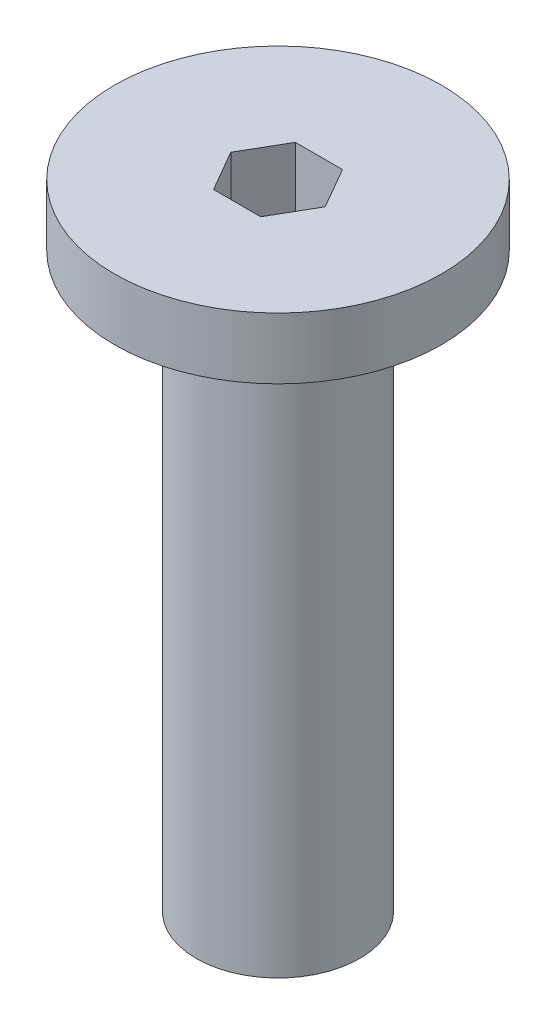
ISO-10303-21;
HEADER;
FILE_DESCRIPTION(('STEP AP214'),'2;1');
FILE_NAME('part.step','',(''),(''),'','','');
FILE_SCHEMA(('AUTOMOTIVE_DESIGN { 1 0 10303 214 1 1 1 1 }'));
ENDSEC;
DATA;
#1=APPLICATION_CONTEXT('core data for automotive mechanical design processes');
#2=APPLICATION_PROTOCOL_DEFINITION('international standard','automotive_design',2000,#1);
#3=PRODUCT_CONTEXT('',#1,'mechanical');
#4=PRODUCT('Part','Part','',(#3));
#5=PRODUCT_RELATED_PRODUCT_CATEGORY('part','',(#4));
#6=PRODUCT_DEFINITION_FORMATION('','',#4);
#7=PRODUCT_DEFINITION_CONTEXT('part definition',#1,'design');
#8=PRODUCT_DEFINITION('design','',#6,#7);
#9=PRODUCT_DEFINITION_SHAPE('','',#8);
#10=(LENGTH_UNIT() NAMED_UNIT(*) SI_UNIT(.MILLI.,.METRE.));
#11=(NAMED_UNIT(*) PLANE_ANGLE_UNIT() SI_UNIT($,.RADIAN.));
#12=(NAMED_UNIT(*) SI_UNIT($,.STERADIAN.) SOLID_ANGLE_UNIT());
#13=UNCERTAINTY_MEASURE_WITH_UNIT(LENGTH_MEASURE(1.E-05),#10,'distance_accuracy_value','');
#14=(GEOMETRIC_REPRESENTATION_CONTEXT(3) GLOBAL_UNCERTAINTY_ASSIGNED_CONTEXT((#13)) GLOBAL_UNIT_ASSIGNED_CONTEXT((#10,
#11,#12)) REPRESENTATION_CONTEXT('',''));
#15=CARTESIAN_POINT('',(0.,0.,0.));
#16=DIRECTION('',(0.,0.,1.));
#17=DIRECTION('',(1.,0.,0.));
#18=AXIS2_PLACEMENT_3D('',#15,#16,#17);
#19=CARTESIAN_POINT('',(4.00000000000001,1.5,0.));
#20=DIRECTION('',(0.,-1.,0.));
#21=DIRECTION('',(0.,0.,-1.));
#22=AXIS2_PLACEMENT_3D('',#19,#20,#21);
#23=PLANE('',#22);
#24=DIRECTION('',(-1.,0.,0.));
#25=VECTOR('',#24,1.);
#26=CARTESIAN_POINT('',(0.577350269189626,1.5,-1.));
#27=LINE('',#26,#25);
#28=CARTESIAN_POINT('',(0.577350269189625,1.5,-1.));
#29=VERTEX_POINT('',#28);
#30=CARTESIAN_POINT('',(-0.577350269189626,1.5,-1.));
#31=VERTEX_POINT('',#30);
#32=EDGE_CURVE('E124',#29,#31,#27,.T.);
#33=ORIENTED_EDGE('',*,*,#32,.F.);
#34=DIRECTION('',(-0.5,0.,-0.866025403784439));
#35=VECTOR('',#34,1.);
#36=CARTESIAN_POINT('',(1.15470053837925,1.5,0.));
#37=LINE('',#36,#35);
#38=CARTESIAN_POINT('',(1.15470053837925,1.5,0.));
#39=VERTEX_POINT('',#38);
#40=EDGE_CURVE('E50',#39,#29,#37,.T.);
#41=ORIENTED_EDGE('',*,*,#40,.F.);
#42=DIRECTION('',(0.5,0.,-0.866025403784439));
#43=VECTOR('',#42,1.);
#44=CARTESIAN_POINT('',(0.577350269189626,1.5,1.));
#45=LINE('',#44,#43);
#46=CARTESIAN_POINT('',(0.577350269189626,1.5,1.));
#47=VERTEX_POINT('',#46);
#48=EDGE_CURVE('E133',#47,#39,#45,.T.);
#49=ORIENTED_EDGE('',*,*,#48,.F.);
#50=DIRECTION('',(1.,0.,0.));
#51=VECTOR('',#50,1.);
#52=CARTESIAN_POINT('',(-0.577350269189626,1.5,1.));
#53=LINE('',#52,#51);
#54=CARTESIAN_POINT('',(-0.577350269189626,1.5,1.));
#55=VERTEX_POINT('',#54);
#56=EDGE_CURVE('E131',#55,#47,#53,.T.);
#57=ORIENTED_EDGE('',*,*,#56,.F.);
#58=DIRECTION('',(0.5,0.,0.866025403784439));
#59=VECTOR('',#58,1.);
#60=CARTESIAN_POINT('',(-1.15470053837925,1.5,0.));
#61=LINE('',#60,#59);
#62=CARTESIAN_POINT('',(-1.15470053837925,1.5,0.));
#63=VERTEX_POINT('',#62);
#64=EDGE_CURVE('E98',#63,#55,#61,.T.);
#65=ORIENTED_EDGE('',*,*,#64,.F.);
#66=DIRECTION('',(-0.5,0.,0.866025403784439));
#67=VECTOR('',#66,1.);
#68=CARTESIAN_POINT('',(-0.577350269189626,1.5,-1.));
#69=LINE('',#68,#67);
#70=EDGE_CURVE('E127',#31,#63,#69,.T.);
#71=ORIENTED_EDGE('',*,*,#70,.F.);
#72=EDGE_LOOP('',(#33,#41,#49,#57,#65,#71));
#73=FACE_BOUND('',#72,.T.);
#74=CARTESIAN_POINT('',(0.,1.5,0.));
#75=DIRECTION('',(0.,1.,0.));
#76=DIRECTION('',(0.,0.,1.));
#77=AXIS2_PLACEMENT_3D('',#74,#75,#76);
#78=CIRCLE('',#77,4.00000000000001);
#79=CARTESIAN_POINT('',(0.,1.5,4.00000000000001));
#80=VERTEX_POINT('',#79);
#81=EDGE_CURVE('E11',#80,#80,#78,.T.);
#82=ORIENTED_EDGE('',*,*,#81,.T.);
#83=EDGE_LOOP('',(#82));
#84=FACE_BOUND('',#83,.T.);
#85=ADVANCED_FACE('F36',(#73,#84),#23,.F.);
#86=CARTESIAN_POINT('',(0.,61.6916426261037,0.));
#87=DIRECTION('',(0.,1.,0.));
#88=DIRECTION('',(0.,0.,1.));
#89=AXIS2_PLACEMENT_3D('',#86,#87,#88);
#90=CYLINDRICAL_SURFACE('',#89,4.00000000000001);
#91=ORIENTED_EDGE('',*,*,#81,.F.);
#92=EDGE_LOOP('',(#91));
#93=FACE_BOUND('',#92,.T.);
#94=CARTESIAN_POINT('',(0.,0.,0.));
#95=DIRECTION('',(0.,1.,0.));
#96=DIRECTION('',(0.,0.,1.));
#97=AXIS2_PLACEMENT_3D('',#94,#95,#96);
#98=CIRCLE('',#97,4.00000000000001);
#99=CARTESIAN_POINT('',(0.,0.,4.00000000000001));
#100=VERTEX_POINT('',#99);
#101=EDGE_CURVE('E43',#100,#100,#98,.T.);
#102=ORIENTED_EDGE('',*,*,#101,.T.);
#103=EDGE_LOOP('',(#102));
#104=FACE_BOUND('',#103,.T.);
#105=ADVANCED_FACE('F150',(#93,#104),#90,.T.);
#106=CARTESIAN_POINT('',(2.00000000000001,0.,0.));
#107=DIRECTION('',(0.,1.,0.));
#108=DIRECTION('',(0.,0.,1.));
#109=AXIS2_PLACEMENT_3D('',#106,#107,#108);
#110=PLANE('',#109);
#111=ORIENTED_EDGE('',*,*,#101,.F.);
#112=EDGE_LOOP('',(#111));
#113=FACE_BOUND('',#112,.T.);
#114=CARTESIAN_POINT('',(0.,0.,0.));
#115=DIRECTION('',(0.,1.,0.));
#116=DIRECTION('',(0.,0.,1.));
#117=AXIS2_PLACEMENT_3D('',#114,#115,#116);
#118=CIRCLE('',#117,2.00000000000001);
#119=CARTESIAN_POINT('',(0.,0.,2.00000000000001));
#120=VERTEX_POINT('',#119);
#121=EDGE_CURVE('E145',#120,#120,#118,.T.);
#122=ORIENTED_EDGE('',*,*,#121,.T.);
#123=EDGE_LOOP('',(#122));
#124=FACE_BOUND('',#123,.T.);
#125=ADVANCED_FACE('F152',(#113,#124),#110,.F.);
#126=CARTESIAN_POINT('',(0.,61.6916426261037,0.));
#127=DIRECTION('',(0.,1.,0.));
#128=DIRECTION('',(0.,0.,1.));
#129=AXIS2_PLACEMENT_3D('',#126,#127,#128);
#130=CYLINDRICAL_SURFACE('',#129,2.00000000000001);
#131=ORIENTED_EDGE('',*,*,#121,.F.);
#132=EDGE_LOOP('',(#131));
#133=FACE_BOUND('',#132,.T.);
#134=CARTESIAN_POINT('',(0.,-14.,0.));
#135=DIRECTION('',(0.,1.,0.));
#136=DIRECTION('',(0.,0.,1.));
#137=AXIS2_PLACEMENT_3D('',#134,#135,#136);
#138=CIRCLE('',#137,2.00000000000001);
#139=CARTESIAN_POINT('',(0.,-14.,2.00000000000001));
#140=VERTEX_POINT('',#139);
#141=EDGE_CURVE('E137',#140,#140,#138,.T.);
#142=ORIENTED_EDGE('',*,*,#141,.T.);
#143=EDGE_LOOP('',(#142));
#144=FACE_BOUND('',#143,.T.);
#145=ADVANCED_FACE('F155',(#133,#144),#130,.T.);
#146=CARTESIAN_POINT('',(0.,-14.,0.));
#147=DIRECTION('',(0.,1.,0.));
#148=DIRECTION('',(0.,0.,1.));
#149=AXIS2_PLACEMENT_3D('',#146,#147,#148);
#150=PLANE('',#149);
#151=ORIENTED_EDGE('',*,*,#141,.F.);
#152=EDGE_LOOP('',(#151));
#153=FACE_BOUND('',#152,.T.);
#154=ADVANCED_FACE('F161',(#153),#150,.F.);
#155=CARTESIAN_POINT('',(1.15470053837925,-1.,0.));
#156=DIRECTION('',(0.866025403784439,0.,-0.5));
#157=DIRECTION('',(-0.5,0.,-0.866025403784439));
#158=AXIS2_PLACEMENT_3D('',#155,#156,#157);
#159=PLANE('',#158);
#160=ORIENTED_EDGE('',*,*,#40,.T.);
#161=DIRECTION('',(0.,1.,0.));
#162=VECTOR('',#161,1.);
#163=CARTESIAN_POINT('',(0.577350269189626,-1.,-1.));
#164=LINE('',#163,#162);
#165=CARTESIAN_POINT('',(0.577350269189626,-1.,-1.));
#166=VERTEX_POINT('',#165);
#167=EDGE_CURVE('E80',#166,#29,#164,.T.);
#168=ORIENTED_EDGE('',*,*,#167,.F.);
#169=DIRECTION('',(-0.5,0.,-0.866025403784439));
#170=VECTOR('',#169,1.);
#171=CARTESIAN_POINT('',(1.15470053837925,-1.,0.));
#172=LINE('',#171,#170);
#173=CARTESIAN_POINT('',(1.15470053837925,-1.,0.));
#174=VERTEX_POINT('',#173);
#175=EDGE_CURVE('E135',#174,#166,#172,.T.);
#176=ORIENTED_EDGE('',*,*,#175,.F.);
#177=DIRECTION('',(0.,1.,0.));
#178=VECTOR('',#177,1.);
#179=CARTESIAN_POINT('',(1.15470053837925,-1.,0.));
#180=LINE('',#179,#178);
#181=EDGE_CURVE('E58',#174,#39,#180,.T.);
#182=ORIENTED_EDGE('',*,*,#181,.T.);
#183=EDGE_LOOP('',(#160,#168,#176,#182));
#184=FACE_BOUND('',#183,.T.);
#185=ADVANCED_FACE('F166',(#184),#159,.F.);
#186=CARTESIAN_POINT('',(0.577350269189626,-1.,1.));
#187=DIRECTION('',(0.866025403784439,0.,0.5));
#188=DIRECTION('',(0.5,0.,-0.866025403784439));
#189=AXIS2_PLACEMENT_3D('',#186,#187,#188);
#190=PLANE('',#189);
#191=ORIENTED_EDGE('',*,*,#48,.T.);
#192=ORIENTED_EDGE('',*,*,#181,.F.);
#193=DIRECTION('',(0.5,0.,-0.866025403784439));
#194=VECTOR('',#193,1.);
#195=CARTESIAN_POINT('',(0.577350269189626,-1.,1.));
#196=LINE('',#195,#194);
#197=CARTESIAN_POINT('',(0.577350269189626,-1.,1.));
#198=VERTEX_POINT('',#197);
#199=EDGE_CURVE('E110',#198,#174,#196,.T.);
#200=ORIENTED_EDGE('',*,*,#199,.F.);
#201=DIRECTION('',(0.,1.,0.));
#202=VECTOR('',#201,1.);
#203=CARTESIAN_POINT('',(0.577350269189626,-1.,1.));
#204=LINE('',#203,#202);
#205=EDGE_CURVE('E102',#198,#47,#204,.T.);
#206=ORIENTED_EDGE('',*,*,#205,.T.);
#207=EDGE_LOOP('',(#191,#192,#200,#206));
#208=FACE_BOUND('',#207,.T.);
#209=ADVANCED_FACE('F171',(#208),#190,.F.);
#210=CARTESIAN_POINT('',(-0.577350269189626,-1.,1.));
#211=DIRECTION('',(0.,0.,1.));
#212=DIRECTION('',(1.,0.,0.));
#213=AXIS2_PLACEMENT_3D('',#210,#211,#212);
#214=PLANE('',#213);
#215=ORIENTED_EDGE('',*,*,#56,.T.);
#216=ORIENTED_EDGE('',*,*,#205,.F.);
#217=DIRECTION('',(1.,0.,0.));
#218=VECTOR('',#217,1.);
#219=CARTESIAN_POINT('',(-0.577350269189626,-1.,1.));
#220=LINE('',#219,#218);
#221=CARTESIAN_POINT('',(-0.577350269189626,-1.,1.));
#222=VERTEX_POINT('',#221);
#223=EDGE_CURVE('E106',#222,#198,#220,.T.);
#224=ORIENTED_EDGE('',*,*,#223,.F.);
#225=DIRECTION('',(0.,1.,0.));
#226=VECTOR('',#225,1.);
#227=CARTESIAN_POINT('',(-0.577350269189626,-1.,1.));
#228=LINE('',#227,#226);
#229=EDGE_CURVE('E91',#222,#55,#228,.T.);
#230=ORIENTED_EDGE('',*,*,#229,.T.);
#231=EDGE_LOOP('',(#215,#216,#224,#230));
#232=FACE_BOUND('',#231,.T.);
#233=ADVANCED_FACE('F107',(#232),#214,.F.);
#234=CARTESIAN_POINT('',(-1.15470053837925,-1.,0.));
#235=DIRECTION('',(-0.866025403784438,0.,0.5));
#236=DIRECTION('',(0.5,0.,0.866025403784439));
#237=AXIS2_PLACEMENT_3D('',#234,#235,#236);
#238=PLANE('',#237);
#239=ORIENTED_EDGE('',*,*,#64,.T.);
#240=ORIENTED_EDGE('',*,*,#229,.F.);
#241=DIRECTION('',(0.5,0.,0.866025403784439));
#242=VECTOR('',#241,1.);
#243=CARTESIAN_POINT('',(-1.15470053837925,-1.,0.));
#244=LINE('',#243,#242);
#245=CARTESIAN_POINT('',(-1.15470053837925,-1.,0.));
#246=VERTEX_POINT('',#245);
#247=EDGE_CURVE('E95',#246,#222,#244,.T.);
#248=ORIENTED_EDGE('',*,*,#247,.F.);
#249=DIRECTION('',(0.,1.,0.));
#250=VECTOR('',#249,1.);
#251=CARTESIAN_POINT('',(-1.15470053837925,-1.,0.));
#252=LINE('',#251,#250);
#253=EDGE_CURVE('E103',#246,#63,#252,.T.);
#254=ORIENTED_EDGE('',*,*,#253,.T.);
#255=EDGE_LOOP('',(#239,#240,#248,#254));
#256=FACE_BOUND('',#255,.T.);
#257=ADVANCED_FACE('F93',(#256),#238,.F.);
#258=CARTESIAN_POINT('',(-0.577350269189626,-1.,-1.));
#259=DIRECTION('',(-0.866025403784439,0.,-0.5));
#260=DIRECTION('',(-0.5,0.,0.866025403784439));
#261=AXIS2_PLACEMENT_3D('',#258,#259,#260);
#262=PLANE('',#261);
#263=ORIENTED_EDGE('',*,*,#70,.T.);
#264=ORIENTED_EDGE('',*,*,#253,.F.);
#265=DIRECTION('',(-0.5,0.,0.866025403784439));
#266=VECTOR('',#265,1.);
#267=CARTESIAN_POINT('',(-0.577350269189626,-1.,-1.));
#268=LINE('',#267,#266);
#269=CARTESIAN_POINT('',(-0.577350269189626,-1.,-1.));
#270=VERTEX_POINT('',#269);
#271=EDGE_CURVE('E116',#270,#246,#268,.T.);
#272=ORIENTED_EDGE('',*,*,#271,.F.);
#273=DIRECTION('',(0.,1.,0.));
#274=VECTOR('',#273,1.);
#275=CARTESIAN_POINT('',(-0.577350269189626,-1.,-1.));
#276=LINE('',#275,#274);
#277=EDGE_CURVE('E140',#270,#31,#276,.T.);
#278=ORIENTED_EDGE('',*,*,#277,.T.);
#279=EDGE_LOOP('',(#263,#264,#272,#278));
#280=FACE_BOUND('',#279,.T.);
#281=ADVANCED_FACE('F197',(#280),#262,.F.);
#282=CARTESIAN_POINT('',(0.577350269189626,-1.,-1.));
#283=DIRECTION('',(0.,0.,-1.));
#284=DIRECTION('',(-1.,0.,0.));
#285=AXIS2_PLACEMENT_3D('',#282,#283,#284);
#286=PLANE('',#285);
#287=ORIENTED_EDGE('',*,*,#32,.T.);
#288=ORIENTED_EDGE('',*,*,#277,.F.);
#289=DIRECTION('',(-1.,0.,0.));
#290=VECTOR('',#289,1.);
#291=CARTESIAN_POINT('',(0.577350269189626,-1.,-1.));
#292=LINE('',#291,#290);
#293=EDGE_CURVE('E118',#166,#270,#292,.T.);
#294=ORIENTED_EDGE('',*,*,#293,.F.);
#295=ORIENTED_EDGE('',*,*,#167,.T.);
#296=EDGE_LOOP('',(#287,#288,#294,#295));
#297=FACE_BOUND('',#296,.T.);
#298=ADVANCED_FACE('F185',(#297),#286,.F.);
#299=CARTESIAN_POINT('',(0.577350269189626,-1.,-1.));
#300=DIRECTION('',(0.,1.,0.));
#301=DIRECTION('',(0.,0.,1.));
#302=AXIS2_PLACEMENT_3D('',#299,#300,#301);
#303=PLANE('',#302);
#304=ORIENTED_EDGE('',*,*,#175,.T.);
#305=ORIENTED_EDGE('',*,*,#293,.T.);
#306=ORIENTED_EDGE('',*,*,#271,.T.);
#307=ORIENTED_EDGE('',*,*,#247,.T.);
#308=ORIENTED_EDGE('',*,*,#223,.T.);
#309=ORIENTED_EDGE('',*,*,#199,.T.);
#310=EDGE_LOOP('',(#304,#305,#306,#307,#308,#309));
#311=FACE_BOUND('',#310,.T.);
#312=ADVANCED_FACE('F113',(#311),#303,.T.);
#313=CLOSED_SHELL('',(#85,#105,#125,#145,#154,#185,#209,#233,#257,#281,#298,#312));
#314=MANIFOLD_SOLID_BREP('B2',#313);
#315=ADVANCED_BREP_SHAPE_REPRESENTATION('',(#18,#314),#14);
#316=SHAPE_DEFINITION_REPRESENTATION(#9,#315);
ENDSEC;
END-ISO-10303-21;
